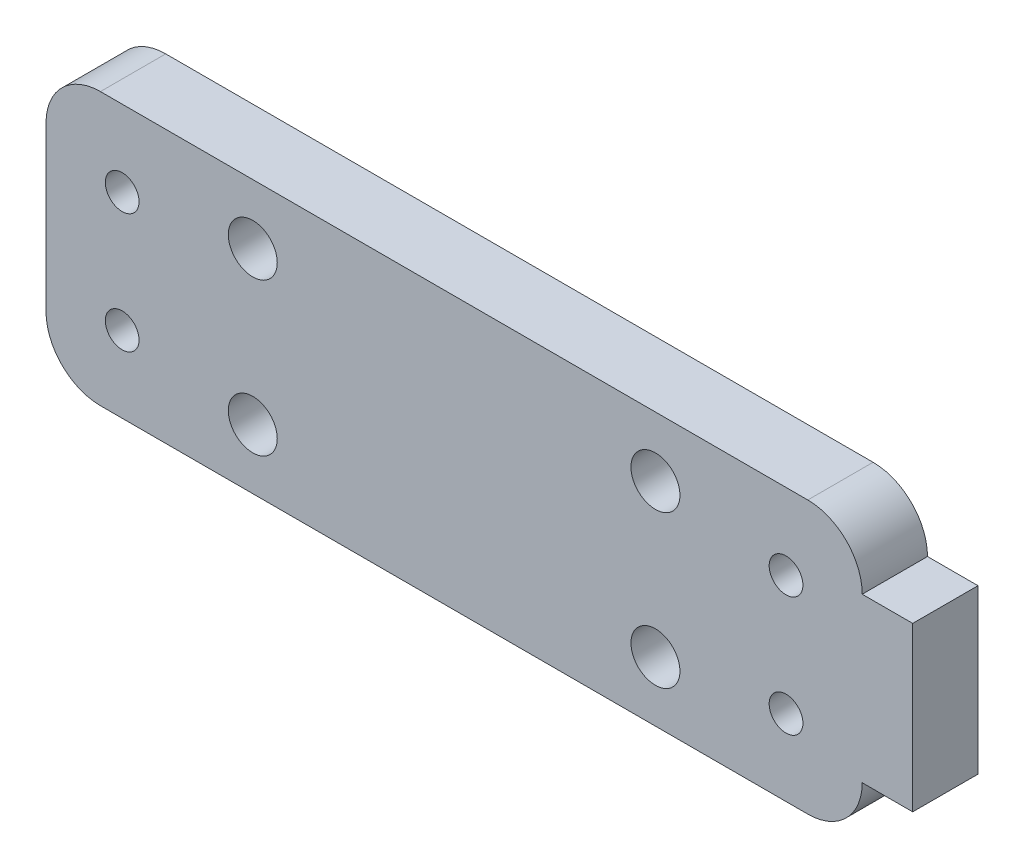
ISO-10303-21;
HEADER;
FILE_DESCRIPTION(('STEP AP214'),'2;1');
FILE_NAME('part.step','',(''),(''),'','','');
FILE_SCHEMA(('AUTOMOTIVE_DESIGN { 1 0 10303 214 1 1 1 1 }'));
ENDSEC;
DATA;
#1=APPLICATION_CONTEXT('core data for automotive mechanical design processes');
#2=APPLICATION_PROTOCOL_DEFINITION('international standard','automotive_design',2000,#1);
#3=PRODUCT_CONTEXT('',#1,'mechanical');
#4=PRODUCT('Part','Part','',(#3));
#5=PRODUCT_RELATED_PRODUCT_CATEGORY('part','',(#4));
#6=PRODUCT_DEFINITION_FORMATION('','',#4);
#7=PRODUCT_DEFINITION_CONTEXT('part definition',#1,'design');
#8=PRODUCT_DEFINITION('design','',#6,#7);
#9=PRODUCT_DEFINITION_SHAPE('','',#8);
#10=(LENGTH_UNIT() NAMED_UNIT(*) SI_UNIT(.MILLI.,.METRE.));
#11=(NAMED_UNIT(*) PLANE_ANGLE_UNIT() SI_UNIT($,.RADIAN.));
#12=(NAMED_UNIT(*) SI_UNIT($,.STERADIAN.) SOLID_ANGLE_UNIT());
#13=UNCERTAINTY_MEASURE_WITH_UNIT(LENGTH_MEASURE(1.E-05),#10,'distance_accuracy_value','');
#14=(GEOMETRIC_REPRESENTATION_CONTEXT(3) GLOBAL_UNCERTAINTY_ASSIGNED_CONTEXT((#13)) GLOBAL_UNIT_ASSIGNED_CONTEXT((#10,
#11,#12)) REPRESENTATION_CONTEXT('',''));
#15=CARTESIAN_POINT('',(0.,0.,0.));
#16=DIRECTION('',(0.,0.,1.));
#17=DIRECTION('',(1.,0.,0.));
#18=AXIS2_PLACEMENT_3D('',#15,#16,#17);
#19=CARTESIAN_POINT('',(70.,-20.,6.));
#20=DIRECTION('',(0.,0.,1.));
#21=DIRECTION('',(1.,0.,0.));
#22=AXIS2_PLACEMENT_3D('',#19,#20,#21);
#23=PLANE('',#22);
#24=CARTESIAN_POINT('',(56.,-5.5,6.));
#25=DIRECTION('',(0.,0.,1.));
#26=DIRECTION('',(1.,0.,0.));
#27=AXIS2_PLACEMENT_3D('',#24,#25,#26);
#28=CIRCLE('',#27,2.25);
#29=CARTESIAN_POINT('',(58.25,-5.5,6.));
#30=VERTEX_POINT('',#29);
#31=EDGE_CURVE('E210',#30,#30,#28,.T.);
#32=ORIENTED_EDGE('',*,*,#31,.F.);
#33=EDGE_LOOP('',(#32));
#34=FACE_BOUND('',#33,.T.);
#35=CARTESIAN_POINT('',(19.,-5.5,6.));
#36=DIRECTION('',(0.,0.,1.));
#37=DIRECTION('',(1.,0.,0.));
#38=AXIS2_PLACEMENT_3D('',#35,#36,#37);
#39=CIRCLE('',#38,2.25);
#40=CARTESIAN_POINT('',(21.25,-5.5,6.));
#41=VERTEX_POINT('',#40);
#42=EDGE_CURVE('E198',#41,#41,#39,.T.);
#43=ORIENTED_EDGE('',*,*,#42,.F.);
#44=EDGE_LOOP('',(#43));
#45=FACE_BOUND('',#44,.T.);
#46=CARTESIAN_POINT('',(68.,-7.,6.));
#47=DIRECTION('',(0.,0.,1.));
#48=DIRECTION('',(1.,0.,0.));
#49=AXIS2_PLACEMENT_3D('',#46,#47,#48);
#50=CIRCLE('',#49,1.54999999999999);
#51=CARTESIAN_POINT('',(69.55,-7.,6.));
#52=VERTEX_POINT('',#51);
#53=EDGE_CURVE('E186',#52,#52,#50,.T.);
#54=ORIENTED_EDGE('',*,*,#53,.F.);
#55=EDGE_LOOP('',(#54));
#56=FACE_BOUND('',#55,.T.);
#57=CARTESIAN_POINT('',(7.,-7.,6.));
#58=DIRECTION('',(0.,0.,1.));
#59=DIRECTION('',(1.,0.,0.));
#60=AXIS2_PLACEMENT_3D('',#57,#58,#59);
#61=CIRCLE('',#60,1.55);
#62=CARTESIAN_POINT('',(8.55,-7.,6.));
#63=VERTEX_POINT('',#62);
#64=EDGE_CURVE('E130',#63,#63,#61,.T.);
#65=ORIENTED_EDGE('',*,*,#64,.F.);
#66=EDGE_LOOP('',(#65));
#67=FACE_BOUND('',#66,.T.);
#68=CARTESIAN_POINT('',(70.,-20.,6.));
#69=DIRECTION('',(0.,0.,1.));
#70=DIRECTION('',(1.,0.,0.));
#71=AXIS2_PLACEMENT_3D('',#68,#69,#70);
#72=CIRCLE('',#71,5.);
#73=CARTESIAN_POINT('',(70.,-25.,6.));
#74=VERTEX_POINT('',#73);
#75=CARTESIAN_POINT('',(75.,-20.,6.));
#76=VERTEX_POINT('',#75);
#77=EDGE_CURVE('E139',#74,#76,#72,.T.);
#78=ORIENTED_EDGE('',*,*,#77,.T.);
#79=DIRECTION('',(-1.,0.,0.));
#80=VECTOR('',#79,1.);
#81=CARTESIAN_POINT('',(79.64,-20.,6.));
#82=LINE('',#81,#80);
#83=CARTESIAN_POINT('',(79.64,-20.,6.));
#84=VERTEX_POINT('',#83);
#85=EDGE_CURVE('E222',#84,#76,#82,.T.);
#86=ORIENTED_EDGE('',*,*,#85,.F.);
#87=DIRECTION('',(0.,-1.,0.));
#88=VECTOR('',#87,1.);
#89=CARTESIAN_POINT('',(79.64,-5.,6.));
#90=LINE('',#89,#88);
#91=CARTESIAN_POINT('',(79.64,-5.,6.));
#92=VERTEX_POINT('',#91);
#93=EDGE_CURVE('E242',#92,#84,#90,.T.);
#94=ORIENTED_EDGE('',*,*,#93,.F.);
#95=DIRECTION('',(-1.,0.,0.));
#96=VECTOR('',#95,1.);
#97=CARTESIAN_POINT('',(79.64,-5.,6.));
#98=LINE('',#97,#96);
#99=CARTESIAN_POINT('',(75.,-5.,6.));
#100=VERTEX_POINT('',#99);
#101=EDGE_CURVE('E231',#92,#100,#98,.T.);
#102=ORIENTED_EDGE('',*,*,#101,.T.);
#103=CARTESIAN_POINT('',(70.,-5.,6.));
#104=DIRECTION('',(0.,0.,1.));
#105=DIRECTION('',(1.,0.,0.));
#106=AXIS2_PLACEMENT_3D('',#103,#104,#105);
#107=CIRCLE('',#106,5.);
#108=CARTESIAN_POINT('',(70.,0.,6.));
#109=VERTEX_POINT('',#108);
#110=EDGE_CURVE('E91',#100,#109,#107,.T.);
#111=ORIENTED_EDGE('',*,*,#110,.T.);
#112=DIRECTION('',(-1.,0.,0.));
#113=VECTOR('',#112,1.);
#114=CARTESIAN_POINT('',(5.,0.,6.));
#115=LINE('',#114,#113);
#116=CARTESIAN_POINT('',(5.,0.,6.));
#117=VERTEX_POINT('',#116);
#118=EDGE_CURVE('E172',#109,#117,#115,.T.);
#119=ORIENTED_EDGE('',*,*,#118,.T.);
#120=CARTESIAN_POINT('',(5.,-5.,6.));
#121=DIRECTION('',(0.,0.,1.));
#122=DIRECTION('',(1.,0.,0.));
#123=AXIS2_PLACEMENT_3D('',#120,#121,#122);
#124=CIRCLE('',#123,5.);
#125=CARTESIAN_POINT('',(0.,-5.,6.));
#126=VERTEX_POINT('',#125);
#127=EDGE_CURVE('E108',#117,#126,#124,.T.);
#128=ORIENTED_EDGE('',*,*,#127,.T.);
#129=DIRECTION('',(0.,-1.,0.));
#130=VECTOR('',#129,1.);
#131=CARTESIAN_POINT('',(0.,-5.,6.));
#132=LINE('',#131,#130);
#133=CARTESIAN_POINT('',(0.,-20.,6.));
#134=VERTEX_POINT('',#133);
#135=EDGE_CURVE('E102',#126,#134,#132,.T.);
#136=ORIENTED_EDGE('',*,*,#135,.T.);
#137=CARTESIAN_POINT('',(5.,-20.,6.));
#138=DIRECTION('',(0.,0.,1.));
#139=DIRECTION('',(-1.,0.,0.));
#140=AXIS2_PLACEMENT_3D('',#137,#138,#139);
#141=CIRCLE('',#140,5.);
#142=CARTESIAN_POINT('',(5.,-25.,6.));
#143=VERTEX_POINT('',#142);
#144=EDGE_CURVE('E106',#134,#143,#141,.T.);
#145=ORIENTED_EDGE('',*,*,#144,.T.);
#146=DIRECTION('',(1.,0.,0.));
#147=VECTOR('',#146,1.);
#148=CARTESIAN_POINT('',(5.,-25.,6.));
#149=LINE('',#148,#147);
#150=EDGE_CURVE('E50',#143,#74,#149,.T.);
#151=ORIENTED_EDGE('',*,*,#150,.T.);
#152=EDGE_LOOP('',(#78,#86,#94,#102,#111,#119,#128,#136,#145,#151));
#153=FACE_BOUND('',#152,.T.);
#154=CARTESIAN_POINT('',(7.,-18.,6.));
#155=DIRECTION('',(0.,0.,1.));
#156=DIRECTION('',(1.,0.,0.));
#157=AXIS2_PLACEMENT_3D('',#154,#155,#156);
#158=CIRCLE('',#157,1.55);
#159=CARTESIAN_POINT('',(8.55,-18.,6.));
#160=VERTEX_POINT('',#159);
#161=EDGE_CURVE('E180',#160,#160,#158,.T.);
#162=ORIENTED_EDGE('',*,*,#161,.F.);
#163=EDGE_LOOP('',(#162));
#164=FACE_BOUND('',#163,.T.);
#165=CARTESIAN_POINT('',(68.,-18.,6.));
#166=DIRECTION('',(0.,0.,1.));
#167=DIRECTION('',(1.,0.,0.));
#168=AXIS2_PLACEMENT_3D('',#165,#166,#167);
#169=CIRCLE('',#168,1.54999999999999);
#170=CARTESIAN_POINT('',(69.55,-18.,6.));
#171=VERTEX_POINT('',#170);
#172=EDGE_CURVE('E192',#171,#171,#169,.T.);
#173=ORIENTED_EDGE('',*,*,#172,.F.);
#174=EDGE_LOOP('',(#173));
#175=FACE_BOUND('',#174,.T.);
#176=CARTESIAN_POINT('',(19.,-19.5,6.));
#177=DIRECTION('',(0.,0.,1.));
#178=DIRECTION('',(1.,0.,0.));
#179=AXIS2_PLACEMENT_3D('',#176,#177,#178);
#180=CIRCLE('',#179,2.25);
#181=CARTESIAN_POINT('',(21.25,-19.5,6.));
#182=VERTEX_POINT('',#181);
#183=EDGE_CURVE('E204',#182,#182,#180,.T.);
#184=ORIENTED_EDGE('',*,*,#183,.F.);
#185=EDGE_LOOP('',(#184));
#186=FACE_BOUND('',#185,.T.);
#187=CARTESIAN_POINT('',(56.,-19.5,6.));
#188=DIRECTION('',(0.,0.,1.));
#189=DIRECTION('',(1.,0.,0.));
#190=AXIS2_PLACEMENT_3D('',#187,#188,#189);
#191=CIRCLE('',#190,2.25);
#192=CARTESIAN_POINT('',(58.25,-19.5,6.));
#193=VERTEX_POINT('',#192);
#194=EDGE_CURVE('E216',#193,#193,#191,.T.);
#195=ORIENTED_EDGE('',*,*,#194,.F.);
#196=EDGE_LOOP('',(#195));
#197=FACE_BOUND('',#196,.T.);
#198=ADVANCED_FACE('F33',(#34,#45,#56,#67,#153,#164,#175,#186,#197),#23,.T.);
#199=CARTESIAN_POINT('',(70.,-20.,0.));
#200=DIRECTION('',(0.,0.,1.));
#201=DIRECTION('',(1.,0.,0.));
#202=AXIS2_PLACEMENT_3D('',#199,#200,#201);
#203=PLANE('',#202);
#204=CARTESIAN_POINT('',(70.,-20.,0.));
#205=DIRECTION('',(0.,0.,1.));
#206=DIRECTION('',(1.,0.,0.));
#207=AXIS2_PLACEMENT_3D('',#204,#205,#206);
#208=CIRCLE('',#207,5.);
#209=CARTESIAN_POINT('',(70.,-25.,0.));
#210=VERTEX_POINT('',#209);
#211=CARTESIAN_POINT('',(75.,-20.,0.));
#212=VERTEX_POINT('',#211);
#213=EDGE_CURVE('E126',#210,#212,#208,.T.);
#214=ORIENTED_EDGE('',*,*,#213,.F.);
#215=DIRECTION('',(1.,0.,0.));
#216=VECTOR('',#215,1.);
#217=CARTESIAN_POINT('',(5.,-25.,0.));
#218=LINE('',#217,#216);
#219=CARTESIAN_POINT('',(5.,-25.,0.));
#220=VERTEX_POINT('',#219);
#221=EDGE_CURVE('E83',#220,#210,#218,.T.);
#222=ORIENTED_EDGE('',*,*,#221,.F.);
#223=CARTESIAN_POINT('',(5.,-20.,0.));
#224=DIRECTION('',(0.,0.,1.));
#225=DIRECTION('',(-1.,0.,0.));
#226=AXIS2_PLACEMENT_3D('',#223,#224,#225);
#227=CIRCLE('',#226,5.);
#228=CARTESIAN_POINT('',(0.,-20.,0.));
#229=VERTEX_POINT('',#228);
#230=EDGE_CURVE('E77',#229,#220,#227,.T.);
#231=ORIENTED_EDGE('',*,*,#230,.F.);
#232=DIRECTION('',(0.,-1.,0.));
#233=VECTOR('',#232,1.);
#234=CARTESIAN_POINT('',(0.,-5.,0.));
#235=LINE('',#234,#233);
#236=CARTESIAN_POINT('',(0.,-5.,0.));
#237=VERTEX_POINT('',#236);
#238=EDGE_CURVE('E116',#237,#229,#235,.T.);
#239=ORIENTED_EDGE('',*,*,#238,.F.);
#240=CARTESIAN_POINT('',(5.,-5.,0.));
#241=DIRECTION('',(0.,0.,1.));
#242=DIRECTION('',(1.,0.,0.));
#243=AXIS2_PLACEMENT_3D('',#240,#241,#242);
#244=CIRCLE('',#243,5.);
#245=CARTESIAN_POINT('',(5.,0.,0.));
#246=VERTEX_POINT('',#245);
#247=EDGE_CURVE('E134',#246,#237,#244,.T.);
#248=ORIENTED_EDGE('',*,*,#247,.F.);
#249=DIRECTION('',(-1.,0.,0.));
#250=VECTOR('',#249,1.);
#251=CARTESIAN_POINT('',(5.,0.,0.));
#252=LINE('',#251,#250);
#253=CARTESIAN_POINT('',(70.,0.,0.));
#254=VERTEX_POINT('',#253);
#255=EDGE_CURVE('E132',#254,#246,#252,.T.);
#256=ORIENTED_EDGE('',*,*,#255,.F.);
#257=CARTESIAN_POINT('',(70.,-5.,0.));
#258=DIRECTION('',(0.,0.,1.));
#259=DIRECTION('',(1.,0.,0.));
#260=AXIS2_PLACEMENT_3D('',#257,#258,#259);
#261=CIRCLE('',#260,5.);
#262=CARTESIAN_POINT('',(75.,-5.,0.));
#263=VERTEX_POINT('',#262);
#264=EDGE_CURVE('E129',#263,#254,#261,.T.);
#265=ORIENTED_EDGE('',*,*,#264,.F.);
#266=DIRECTION('',(-1.,0.,0.));
#267=VECTOR('',#266,1.);
#268=CARTESIAN_POINT('',(79.64,-5.,0.));
#269=LINE('',#268,#267);
#270=CARTESIAN_POINT('',(79.64,-5.,0.));
#271=VERTEX_POINT('',#270);
#272=EDGE_CURVE('E163',#271,#263,#269,.T.);
#273=ORIENTED_EDGE('',*,*,#272,.F.);
#274=DIRECTION('',(0.,1.,0.));
#275=VECTOR('',#274,1.);
#276=CARTESIAN_POINT('',(79.64,-5.,0.));
#277=LINE('',#276,#275);
#278=CARTESIAN_POINT('',(79.64,-20.,0.));
#279=VERTEX_POINT('',#278);
#280=EDGE_CURVE('E236',#279,#271,#277,.T.);
#281=ORIENTED_EDGE('',*,*,#280,.F.);
#282=DIRECTION('',(-1.,0.,0.));
#283=VECTOR('',#282,1.);
#284=CARTESIAN_POINT('',(79.64,-20.,0.));
#285=LINE('',#284,#283);
#286=EDGE_CURVE('E227',#279,#212,#285,.T.);
#287=ORIENTED_EDGE('',*,*,#286,.T.);
#288=EDGE_LOOP('',(#214,#222,#231,#239,#248,#256,#265,#273,#281,#287));
#289=FACE_BOUND('',#288,.T.);
#290=CARTESIAN_POINT('',(7.,-7.,0.));
#291=DIRECTION('',(0.,0.,1.));
#292=DIRECTION('',(1.,0.,0.));
#293=AXIS2_PLACEMENT_3D('',#290,#291,#292);
#294=CIRCLE('',#293,1.55);
#295=CARTESIAN_POINT('',(8.55,-7.,0.));
#296=VERTEX_POINT('',#295);
#297=EDGE_CURVE('E177',#296,#296,#294,.T.);
#298=ORIENTED_EDGE('',*,*,#297,.T.);
#299=EDGE_LOOP('',(#298));
#300=FACE_BOUND('',#299,.T.);
#301=CARTESIAN_POINT('',(7.,-18.,0.));
#302=DIRECTION('',(0.,0.,1.));
#303=DIRECTION('',(1.,0.,0.));
#304=AXIS2_PLACEMENT_3D('',#301,#302,#303);
#305=CIRCLE('',#304,1.55);
#306=CARTESIAN_POINT('',(8.55,-18.,0.));
#307=VERTEX_POINT('',#306);
#308=EDGE_CURVE('E183',#307,#307,#305,.T.);
#309=ORIENTED_EDGE('',*,*,#308,.T.);
#310=EDGE_LOOP('',(#309));
#311=FACE_BOUND('',#310,.T.);
#312=CARTESIAN_POINT('',(68.,-7.,0.));
#313=DIRECTION('',(0.,0.,1.));
#314=DIRECTION('',(1.,0.,0.));
#315=AXIS2_PLACEMENT_3D('',#312,#313,#314);
#316=CIRCLE('',#315,1.54999999999999);
#317=CARTESIAN_POINT('',(69.55,-7.,0.));
#318=VERTEX_POINT('',#317);
#319=EDGE_CURVE('E189',#318,#318,#316,.T.);
#320=ORIENTED_EDGE('',*,*,#319,.T.);
#321=EDGE_LOOP('',(#320));
#322=FACE_BOUND('',#321,.T.);
#323=CARTESIAN_POINT('',(68.,-18.,0.));
#324=DIRECTION('',(0.,0.,1.));
#325=DIRECTION('',(1.,0.,0.));
#326=AXIS2_PLACEMENT_3D('',#323,#324,#325);
#327=CIRCLE('',#326,1.54999999999999);
#328=CARTESIAN_POINT('',(69.55,-18.,0.));
#329=VERTEX_POINT('',#328);
#330=EDGE_CURVE('E195',#329,#329,#327,.T.);
#331=ORIENTED_EDGE('',*,*,#330,.T.);
#332=EDGE_LOOP('',(#331));
#333=FACE_BOUND('',#332,.T.);
#334=CARTESIAN_POINT('',(19.,-5.5,0.));
#335=DIRECTION('',(0.,0.,1.));
#336=DIRECTION('',(1.,0.,0.));
#337=AXIS2_PLACEMENT_3D('',#334,#335,#336);
#338=CIRCLE('',#337,2.25);
#339=CARTESIAN_POINT('',(21.25,-5.5,0.));
#340=VERTEX_POINT('',#339);
#341=EDGE_CURVE('E201',#340,#340,#338,.T.);
#342=ORIENTED_EDGE('',*,*,#341,.T.);
#343=EDGE_LOOP('',(#342));
#344=FACE_BOUND('',#343,.T.);
#345=CARTESIAN_POINT('',(19.,-19.5,0.));
#346=DIRECTION('',(0.,0.,1.));
#347=DIRECTION('',(1.,0.,0.));
#348=AXIS2_PLACEMENT_3D('',#345,#346,#347);
#349=CIRCLE('',#348,2.25);
#350=CARTESIAN_POINT('',(21.25,-19.5,0.));
#351=VERTEX_POINT('',#350);
#352=EDGE_CURVE('E207',#351,#351,#349,.T.);
#353=ORIENTED_EDGE('',*,*,#352,.T.);
#354=EDGE_LOOP('',(#353));
#355=FACE_BOUND('',#354,.T.);
#356=CARTESIAN_POINT('',(56.,-5.5,0.));
#357=DIRECTION('',(0.,0.,1.));
#358=DIRECTION('',(1.,0.,0.));
#359=AXIS2_PLACEMENT_3D('',#356,#357,#358);
#360=CIRCLE('',#359,2.25);
#361=CARTESIAN_POINT('',(58.25,-5.5,0.));
#362=VERTEX_POINT('',#361);
#363=EDGE_CURVE('E213',#362,#362,#360,.T.);
#364=ORIENTED_EDGE('',*,*,#363,.T.);
#365=EDGE_LOOP('',(#364));
#366=FACE_BOUND('',#365,.T.);
#367=CARTESIAN_POINT('',(56.,-19.5,0.));
#368=DIRECTION('',(0.,0.,1.));
#369=DIRECTION('',(1.,0.,0.));
#370=AXIS2_PLACEMENT_3D('',#367,#368,#369);
#371=CIRCLE('',#370,2.25);
#372=CARTESIAN_POINT('',(58.25,-19.5,0.));
#373=VERTEX_POINT('',#372);
#374=EDGE_CURVE('E219',#373,#373,#371,.T.);
#375=ORIENTED_EDGE('',*,*,#374,.T.);
#376=EDGE_LOOP('',(#375));
#377=FACE_BOUND('',#376,.T.);
#378=ADVANCED_FACE('F159',(#289,#300,#311,#322,#333,#344,#355,#366,#377),#203,.F.);
#379=CARTESIAN_POINT('',(70.,-20.,6.));
#380=DIRECTION('',(0.,0.,-1.));
#381=DIRECTION('',(-1.,0.,0.));
#382=AXIS2_PLACEMENT_3D('',#379,#380,#381);
#383=CYLINDRICAL_SURFACE('',#382,5.);
#384=ORIENTED_EDGE('',*,*,#213,.T.);
#385=DIRECTION('',(0.,0.,-1.));
#386=VECTOR('',#385,1.);
#387=CARTESIAN_POINT('',(75.,-20.,6.));
#388=LINE('',#387,#386);
#389=EDGE_CURVE('E11',#76,#212,#388,.T.);
#390=ORIENTED_EDGE('',*,*,#389,.F.);
#391=ORIENTED_EDGE('',*,*,#77,.F.);
#392=DIRECTION('',(0.,0.,-1.));
#393=VECTOR('',#392,1.);
#394=CARTESIAN_POINT('',(70.,-25.,6.));
#395=LINE('',#394,#393);
#396=EDGE_CURVE('E122',#74,#210,#395,.T.);
#397=ORIENTED_EDGE('',*,*,#396,.T.);
#398=EDGE_LOOP('',(#384,#390,#391,#397));
#399=FACE_BOUND('',#398,.T.);
#400=ADVANCED_FACE('F35',(#399),#383,.T.);
#401=CARTESIAN_POINT('',(70.,-5.,6.));
#402=DIRECTION('',(0.,0.,-1.));
#403=DIRECTION('',(-1.,0.,0.));
#404=AXIS2_PLACEMENT_3D('',#401,#402,#403);
#405=CYLINDRICAL_SURFACE('',#404,5.);
#406=ORIENTED_EDGE('',*,*,#264,.T.);
#407=DIRECTION('',(0.,0.,-1.));
#408=VECTOR('',#407,1.);
#409=CARTESIAN_POINT('',(70.,0.,6.));
#410=LINE('',#409,#408);
#411=EDGE_CURVE('E146',#109,#254,#410,.T.);
#412=ORIENTED_EDGE('',*,*,#411,.F.);
#413=ORIENTED_EDGE('',*,*,#110,.F.);
#414=DIRECTION('',(0.,0.,-1.));
#415=VECTOR('',#414,1.);
#416=CARTESIAN_POINT('',(75.,-5.,6.));
#417=LINE('',#416,#415);
#418=EDGE_CURVE('E42',#100,#263,#417,.T.);
#419=ORIENTED_EDGE('',*,*,#418,.T.);
#420=EDGE_LOOP('',(#406,#412,#413,#419));
#421=FACE_BOUND('',#420,.T.);
#422=ADVANCED_FACE('F152',(#421),#405,.T.);
#423=CARTESIAN_POINT('',(5.,0.,6.));
#424=DIRECTION('',(0.,-1.,0.));
#425=DIRECTION('',(0.,0.,-1.));
#426=AXIS2_PLACEMENT_3D('',#423,#424,#425);
#427=PLANE('',#426);
#428=ORIENTED_EDGE('',*,*,#255,.T.);
#429=DIRECTION('',(0.,0.,-1.));
#430=VECTOR('',#429,1.);
#431=CARTESIAN_POINT('',(5.,0.,6.));
#432=LINE('',#431,#430);
#433=EDGE_CURVE('E143',#117,#246,#432,.T.);
#434=ORIENTED_EDGE('',*,*,#433,.F.);
#435=ORIENTED_EDGE('',*,*,#118,.F.);
#436=ORIENTED_EDGE('',*,*,#411,.T.);
#437=EDGE_LOOP('',(#428,#434,#435,#436));
#438=FACE_BOUND('',#437,.T.);
#439=ADVANCED_FACE('F168',(#438),#427,.F.);
#440=CARTESIAN_POINT('',(5.,-5.,6.));
#441=DIRECTION('',(0.,0.,-1.));
#442=DIRECTION('',(-1.,0.,0.));
#443=AXIS2_PLACEMENT_3D('',#440,#441,#442);
#444=CYLINDRICAL_SURFACE('',#443,5.);
#445=ORIENTED_EDGE('',*,*,#247,.T.);
#446=DIRECTION('',(0.,0.,-1.));
#447=VECTOR('',#446,1.);
#448=CARTESIAN_POINT('',(0.,-5.,6.));
#449=LINE('',#448,#447);
#450=EDGE_CURVE('E117',#126,#237,#449,.T.);
#451=ORIENTED_EDGE('',*,*,#450,.F.);
#452=ORIENTED_EDGE('',*,*,#127,.F.);
#453=ORIENTED_EDGE('',*,*,#433,.T.);
#454=EDGE_LOOP('',(#445,#451,#452,#453));
#455=FACE_BOUND('',#454,.T.);
#456=ADVANCED_FACE('F171',(#455),#444,.T.);
#457=CARTESIAN_POINT('',(0.,-5.,6.));
#458=DIRECTION('',(1.,0.,0.));
#459=DIRECTION('',(0.,1.,0.));
#460=AXIS2_PLACEMENT_3D('',#457,#458,#459);
#461=PLANE('',#460);
#462=ORIENTED_EDGE('',*,*,#238,.T.);
#463=DIRECTION('',(0.,0.,-1.));
#464=VECTOR('',#463,1.);
#465=CARTESIAN_POINT('',(0.,-20.,6.));
#466=LINE('',#465,#464);
#467=EDGE_CURVE('E113',#134,#229,#466,.T.);
#468=ORIENTED_EDGE('',*,*,#467,.F.);
#469=ORIENTED_EDGE('',*,*,#135,.F.);
#470=ORIENTED_EDGE('',*,*,#450,.T.);
#471=EDGE_LOOP('',(#462,#468,#469,#470));
#472=FACE_BOUND('',#471,.T.);
#473=ADVANCED_FACE('F114',(#472),#461,.F.);
#474=CARTESIAN_POINT('',(5.,-20.,6.));
#475=DIRECTION('',(0.,0.,-1.));
#476=DIRECTION('',(-1.,0.,0.));
#477=AXIS2_PLACEMENT_3D('',#474,#475,#476);
#478=CYLINDRICAL_SURFACE('',#477,5.);
#479=ORIENTED_EDGE('',*,*,#230,.T.);
#480=DIRECTION('',(0.,0.,-1.));
#481=VECTOR('',#480,1.);
#482=CARTESIAN_POINT('',(5.,-25.,6.));
#483=LINE('',#482,#481);
#484=EDGE_CURVE('E118',#143,#220,#483,.T.);
#485=ORIENTED_EDGE('',*,*,#484,.F.);
#486=ORIENTED_EDGE('',*,*,#144,.F.);
#487=ORIENTED_EDGE('',*,*,#467,.T.);
#488=EDGE_LOOP('',(#479,#485,#486,#487));
#489=FACE_BOUND('',#488,.T.);
#490=ADVANCED_FACE('F120',(#489),#478,.T.);
#491=CARTESIAN_POINT('',(5.,-25.,6.));
#492=DIRECTION('',(0.,1.,0.));
#493=DIRECTION('',(0.,0.,1.));
#494=AXIS2_PLACEMENT_3D('',#491,#492,#493);
#495=PLANE('',#494);
#496=ORIENTED_EDGE('',*,*,#221,.T.);
#497=ORIENTED_EDGE('',*,*,#396,.F.);
#498=ORIENTED_EDGE('',*,*,#150,.F.);
#499=ORIENTED_EDGE('',*,*,#484,.T.);
#500=EDGE_LOOP('',(#496,#497,#498,#499));
#501=FACE_BOUND('',#500,.T.);
#502=ADVANCED_FACE('F264',(#501),#495,.F.);
#503=CARTESIAN_POINT('',(7.,-7.,6.));
#504=DIRECTION('',(0.,0.,-1.));
#505=DIRECTION('',(-1.,0.,0.));
#506=AXIS2_PLACEMENT_3D('',#503,#504,#505);
#507=CYLINDRICAL_SURFACE('',#506,1.55);
#508=ORIENTED_EDGE('',*,*,#64,.T.);
#509=EDGE_LOOP('',(#508));
#510=FACE_BOUND('',#509,.T.);
#511=ORIENTED_EDGE('',*,*,#297,.F.);
#512=EDGE_LOOP('',(#511));
#513=FACE_BOUND('',#512,.T.);
#514=ADVANCED_FACE('F266',(#510,#513),#507,.F.);
#515=CARTESIAN_POINT('',(7.,-18.,6.));
#516=DIRECTION('',(0.,0.,-1.));
#517=DIRECTION('',(-1.,0.,0.));
#518=AXIS2_PLACEMENT_3D('',#515,#516,#517);
#519=CYLINDRICAL_SURFACE('',#518,1.55);
#520=ORIENTED_EDGE('',*,*,#161,.T.);
#521=EDGE_LOOP('',(#520));
#522=FACE_BOUND('',#521,.T.);
#523=ORIENTED_EDGE('',*,*,#308,.F.);
#524=EDGE_LOOP('',(#523));
#525=FACE_BOUND('',#524,.T.);
#526=ADVANCED_FACE('F272',(#522,#525),#519,.F.);
#527=CARTESIAN_POINT('',(68.,-7.,6.));
#528=DIRECTION('',(0.,0.,-1.));
#529=DIRECTION('',(-1.,0.,0.));
#530=AXIS2_PLACEMENT_3D('',#527,#528,#529);
#531=CYLINDRICAL_SURFACE('',#530,1.54999999999999);
#532=ORIENTED_EDGE('',*,*,#53,.T.);
#533=EDGE_LOOP('',(#532));
#534=FACE_BOUND('',#533,.T.);
#535=ORIENTED_EDGE('',*,*,#319,.F.);
#536=EDGE_LOOP('',(#535));
#537=FACE_BOUND('',#536,.T.);
#538=ADVANCED_FACE('F288',(#534,#537),#531,.F.);
#539=CARTESIAN_POINT('',(68.,-18.,6.));
#540=DIRECTION('',(0.,0.,-1.));
#541=DIRECTION('',(-1.,0.,0.));
#542=AXIS2_PLACEMENT_3D('',#539,#540,#541);
#543=CYLINDRICAL_SURFACE('',#542,1.54999999999999);
#544=ORIENTED_EDGE('',*,*,#172,.T.);
#545=EDGE_LOOP('',(#544));
#546=FACE_BOUND('',#545,.T.);
#547=ORIENTED_EDGE('',*,*,#330,.F.);
#548=EDGE_LOOP('',(#547));
#549=FACE_BOUND('',#548,.T.);
#550=ADVANCED_FACE('F292',(#546,#549),#543,.F.);
#551=CARTESIAN_POINT('',(19.,-5.5,6.));
#552=DIRECTION('',(0.,0.,-1.));
#553=DIRECTION('',(-1.,0.,0.));
#554=AXIS2_PLACEMENT_3D('',#551,#552,#553);
#555=CYLINDRICAL_SURFACE('',#554,2.25);
#556=ORIENTED_EDGE('',*,*,#42,.T.);
#557=EDGE_LOOP('',(#556));
#558=FACE_BOUND('',#557,.T.);
#559=ORIENTED_EDGE('',*,*,#341,.F.);
#560=EDGE_LOOP('',(#559));
#561=FACE_BOUND('',#560,.T.);
#562=ADVANCED_FACE('F296',(#558,#561),#555,.F.);
#563=CARTESIAN_POINT('',(19.,-19.5,6.));
#564=DIRECTION('',(0.,0.,-1.));
#565=DIRECTION('',(-1.,0.,0.));
#566=AXIS2_PLACEMENT_3D('',#563,#564,#565);
#567=CYLINDRICAL_SURFACE('',#566,2.25);
#568=ORIENTED_EDGE('',*,*,#183,.T.);
#569=EDGE_LOOP('',(#568));
#570=FACE_BOUND('',#569,.T.);
#571=ORIENTED_EDGE('',*,*,#352,.F.);
#572=EDGE_LOOP('',(#571));
#573=FACE_BOUND('',#572,.T.);
#574=ADVANCED_FACE('F300',(#570,#573),#567,.F.);
#575=CARTESIAN_POINT('',(56.,-5.5,6.));
#576=DIRECTION('',(0.,0.,-1.));
#577=DIRECTION('',(-1.,0.,0.));
#578=AXIS2_PLACEMENT_3D('',#575,#576,#577);
#579=CYLINDRICAL_SURFACE('',#578,2.25);
#580=ORIENTED_EDGE('',*,*,#31,.T.);
#581=EDGE_LOOP('',(#580));
#582=FACE_BOUND('',#581,.T.);
#583=ORIENTED_EDGE('',*,*,#363,.F.);
#584=EDGE_LOOP('',(#583));
#585=FACE_BOUND('',#584,.T.);
#586=ADVANCED_FACE('F304',(#582,#585),#579,.F.);
#587=CARTESIAN_POINT('',(56.,-19.5,6.));
#588=DIRECTION('',(0.,0.,-1.));
#589=DIRECTION('',(-1.,0.,0.));
#590=AXIS2_PLACEMENT_3D('',#587,#588,#589);
#591=CYLINDRICAL_SURFACE('',#590,2.25);
#592=ORIENTED_EDGE('',*,*,#194,.T.);
#593=EDGE_LOOP('',(#592));
#594=FACE_BOUND('',#593,.T.);
#595=ORIENTED_EDGE('',*,*,#374,.F.);
#596=EDGE_LOOP('',(#595));
#597=FACE_BOUND('',#596,.T.);
#598=ADVANCED_FACE('F308',(#594,#597),#591,.F.);
#599=CARTESIAN_POINT('',(79.64,-20.,6.));
#600=DIRECTION('',(0.,1.,0.));
#601=DIRECTION('',(0.,0.,1.));
#602=AXIS2_PLACEMENT_3D('',#599,#600,#601);
#603=PLANE('',#602);
#604=ORIENTED_EDGE('',*,*,#389,.T.);
#605=ORIENTED_EDGE('',*,*,#286,.F.);
#606=DIRECTION('',(0.,0.,-1.));
#607=VECTOR('',#606,1.);
#608=CARTESIAN_POINT('',(79.64,-20.,6.));
#609=LINE('',#608,#607);
#610=EDGE_CURVE('E239',#84,#279,#609,.T.);
#611=ORIENTED_EDGE('',*,*,#610,.F.);
#612=ORIENTED_EDGE('',*,*,#85,.T.);
#613=EDGE_LOOP('',(#604,#605,#611,#612));
#614=FACE_BOUND('',#613,.T.);
#615=ADVANCED_FACE('F257',(#614),#603,.F.);
#616=CARTESIAN_POINT('',(79.64,-5.,6.));
#617=DIRECTION('',(0.,-1.,0.));
#618=DIRECTION('',(0.,0.,-1.));
#619=AXIS2_PLACEMENT_3D('',#616,#617,#618);
#620=PLANE('',#619);
#621=ORIENTED_EDGE('',*,*,#418,.F.);
#622=ORIENTED_EDGE('',*,*,#101,.F.);
#623=DIRECTION('',(0.,0.,1.));
#624=VECTOR('',#623,1.);
#625=CARTESIAN_POINT('',(79.64,-5.,6.));
#626=LINE('',#625,#624);
#627=EDGE_CURVE('E233',#271,#92,#626,.T.);
#628=ORIENTED_EDGE('',*,*,#627,.F.);
#629=ORIENTED_EDGE('',*,*,#272,.T.);
#630=EDGE_LOOP('',(#621,#622,#628,#629));
#631=FACE_BOUND('',#630,.T.);
#632=ADVANCED_FACE('F315',(#631),#620,.F.);
#633=CARTESIAN_POINT('',(79.64,0.,0.));
#634=DIRECTION('',(1.,0.,0.));
#635=DIRECTION('',(0.,0.,-1.));
#636=AXIS2_PLACEMENT_3D('',#633,#634,#635);
#637=PLANE('',#636);
#638=ORIENTED_EDGE('',*,*,#93,.T.);
#639=ORIENTED_EDGE('',*,*,#610,.T.);
#640=ORIENTED_EDGE('',*,*,#280,.T.);
#641=ORIENTED_EDGE('',*,*,#627,.T.);
#642=EDGE_LOOP('',(#638,#639,#640,#641));
#643=FACE_BOUND('',#642,.T.);
#644=ADVANCED_FACE('F248',(#643),#637,.T.);
#645=CLOSED_SHELL('',(#198,#378,#400,#422,#439,#456,#473,#490,#502,#514,#526,#538,#550,#562,
#574,#586,#598,#615,#632,#644));
#646=MANIFOLD_SOLID_BREP('B2',#645);
#647=ADVANCED_BREP_SHAPE_REPRESENTATION('',(#18,#646),#14);
#648=SHAPE_DEFINITION_REPRESENTATION(#9,#647);
ENDSEC;
END-ISO-10303-21;
